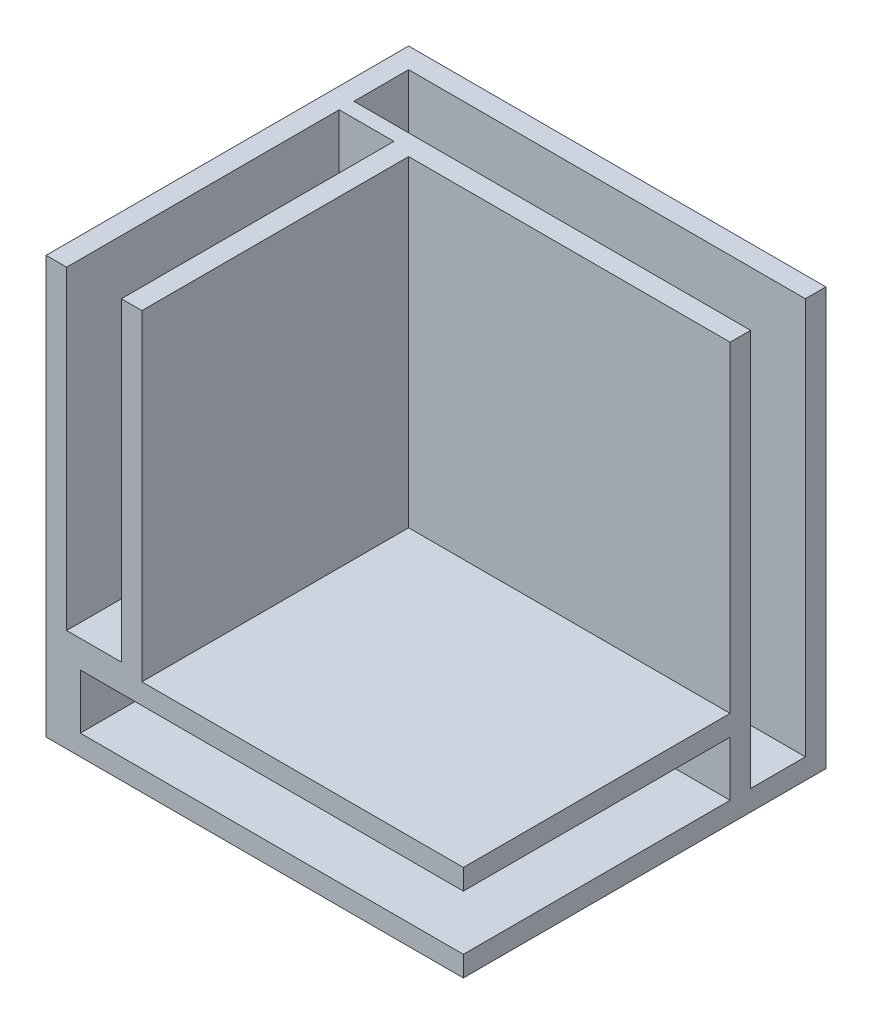
ISO-10303-21;
HEADER;
FILE_DESCRIPTION(('STEP AP214'),'2;1');
FILE_NAME('part.step','',(''),(''),'','','');
FILE_SCHEMA(('AUTOMOTIVE_DESIGN { 1 0 10303 214 1 1 1 1 }'));
ENDSEC;
DATA;
#1=APPLICATION_CONTEXT('core data for automotive mechanical design processes');
#2=APPLICATION_PROTOCOL_DEFINITION('international standard','automotive_design',2000,#1);
#3=PRODUCT_CONTEXT('',#1,'mechanical');
#4=PRODUCT('Part','Part','',(#3));
#5=PRODUCT_RELATED_PRODUCT_CATEGORY('part','',(#4));
#6=PRODUCT_DEFINITION_FORMATION('','',#4);
#7=PRODUCT_DEFINITION_CONTEXT('part definition',#1,'design');
#8=PRODUCT_DEFINITION('design','',#6,#7);
#9=PRODUCT_DEFINITION_SHAPE('','',#8);
#10=(LENGTH_UNIT() NAMED_UNIT(*) SI_UNIT(.MILLI.,.METRE.));
#11=(NAMED_UNIT(*) PLANE_ANGLE_UNIT() SI_UNIT($,.RADIAN.));
#12=(NAMED_UNIT(*) SI_UNIT($,.STERADIAN.) SOLID_ANGLE_UNIT());
#13=UNCERTAINTY_MEASURE_WITH_UNIT(LENGTH_MEASURE(1.E-05),#10,'distance_accuracy_value','');
#14=(GEOMETRIC_REPRESENTATION_CONTEXT(3) GLOBAL_UNCERTAINTY_ASSIGNED_CONTEXT((#13)) GLOBAL_UNIT_ASSIGNED_CONTEXT((#10,
#11,#12)) REPRESENTATION_CONTEXT('',''));
#15=CARTESIAN_POINT('',(0.,0.,0.));
#16=DIRECTION('',(0.,0.,1.));
#17=DIRECTION('',(1.,0.,0.));
#18=AXIS2_PLACEMENT_3D('',#15,#16,#17);
#19=CARTESIAN_POINT('',(5.,0.,26.));
#20=DIRECTION('',(-1.,0.,0.));
#21=DIRECTION('',(0.,0.,1.));
#22=AXIS2_PLACEMENT_3D('',#19,#20,#21);
#23=PLANE('',#22);
#24=DIRECTION('',(0.,1.,0.));
#25=VECTOR('',#24,1.);
#26=CARTESIAN_POINT('',(5.,30.,6.07514362919426));
#27=LINE('',#26,#25);
#28=CARTESIAN_POINT('',(5.,7.,6.07514362919426));
#29=VERTEX_POINT('',#28);
#30=CARTESIAN_POINT('',(5.,30.,6.07514362919426));
#31=VERTEX_POINT('',#30);
#32=EDGE_CURVE('E254',#29,#31,#27,.T.);
#33=ORIENTED_EDGE('',*,*,#32,.F.);
#34=DIRECTION('',(0.,0.,-1.));
#35=VECTOR('',#34,1.);
#36=CARTESIAN_POINT('',(5.,7.,26.));
#37=LINE('',#36,#35);
#38=CARTESIAN_POINT('',(5.,7.,26.));
#39=VERTEX_POINT('',#38);
#40=EDGE_CURVE('E271',#39,#29,#37,.T.);
#41=ORIENTED_EDGE('',*,*,#40,.F.);
#42=DIRECTION('',(0.,1.,0.));
#43=VECTOR('',#42,1.);
#44=CARTESIAN_POINT('',(5.,7.,26.));
#45=LINE('',#44,#43);
#46=CARTESIAN_POINT('',(5.,30.,26.));
#47=VERTEX_POINT('',#46);
#48=EDGE_CURVE('E251',#39,#47,#45,.T.);
#49=ORIENTED_EDGE('',*,*,#48,.T.);
#50=DIRECTION('',(0.,0.,-1.));
#51=VECTOR('',#50,1.);
#52=CARTESIAN_POINT('',(5.,30.,6.));
#53=LINE('',#52,#51);
#54=EDGE_CURVE('E275',#47,#31,#53,.T.);
#55=ORIENTED_EDGE('',*,*,#54,.T.);
#56=EDGE_LOOP('',(#33,#41,#49,#55));
#57=FACE_BOUND('',#56,.T.);
#58=ADVANCED_FACE('F37',(#57),#23,.T.);
#59=CARTESIAN_POINT('',(0.,7.,26.));
#60=DIRECTION('',(0.,-1.,0.));
#61=DIRECTION('',(1.,0.,0.));
#62=AXIS2_PLACEMENT_3D('',#59,#60,#61);
#63=PLANE('',#62);
#64=DIRECTION('',(1.,0.,0.));
#65=VECTOR('',#64,1.);
#66=CARTESIAN_POINT('',(0.,7.,6.07514362919426));
#67=LINE('',#66,#65);
#68=CARTESIAN_POINT('',(1.,7.,6.07514362919426));
#69=VERTEX_POINT('',#68);
#70=EDGE_CURVE('E260',#69,#29,#67,.T.);
#71=ORIENTED_EDGE('',*,*,#70,.F.);
#72=DIRECTION('',(0.,0.,-1.));
#73=VECTOR('',#72,1.);
#74=CARTESIAN_POINT('',(1.,7.,6.));
#75=LINE('',#74,#73);
#76=CARTESIAN_POINT('',(1.,7.,26.));
#77=VERTEX_POINT('',#76);
#78=EDGE_CURVE('E273',#77,#69,#75,.T.);
#79=ORIENTED_EDGE('',*,*,#78,.F.);
#80=DIRECTION('',(1.,0.,0.));
#81=VECTOR('',#80,1.);
#82=CARTESIAN_POINT('',(1.,7.,26.));
#83=LINE('',#82,#81);
#84=EDGE_CURVE('E248',#77,#39,#83,.T.);
#85=ORIENTED_EDGE('',*,*,#84,.T.);
#86=ORIENTED_EDGE('',*,*,#40,.T.);
#87=EDGE_LOOP('',(#71,#79,#85,#86));
#88=FACE_BOUND('',#87,.T.);
#89=ADVANCED_FACE('F346',(#88),#63,.F.);
#90=CARTESIAN_POINT('',(1.,0.,6.));
#91=DIRECTION('',(1.,0.,0.));
#92=DIRECTION('',(0.,0.,-1.));
#93=AXIS2_PLACEMENT_3D('',#90,#91,#92);
#94=PLANE('',#93);
#95=DIRECTION('',(0.,0.,-1.));
#96=VECTOR('',#95,1.);
#97=CARTESIAN_POINT('',(1.,30.,6.));
#98=LINE('',#97,#96);
#99=CARTESIAN_POINT('',(1.,30.,5.));
#100=VERTEX_POINT('',#99);
#101=CARTESIAN_POINT('',(1.,30.,1.));
#102=VERTEX_POINT('',#101);
#103=EDGE_CURVE('E290',#100,#102,#98,.T.);
#104=ORIENTED_EDGE('',*,*,#103,.F.);
#105=DIRECTION('',(0.,-1.,0.));
#106=VECTOR('',#105,1.);
#107=CARTESIAN_POINT('',(1.,0.,5.));
#108=LINE('',#107,#106);
#109=CARTESIAN_POINT('',(1.,1.,5.));
#110=VERTEX_POINT('',#109);
#111=EDGE_CURVE('E264',#100,#110,#108,.T.);
#112=ORIENTED_EDGE('',*,*,#111,.T.);
#113=DIRECTION('',(0.,0.,-1.));
#114=VECTOR('',#113,1.);
#115=CARTESIAN_POINT('',(1.,1.,6.));
#116=LINE('',#115,#114);
#117=CARTESIAN_POINT('',(1.,1.,1.));
#118=VERTEX_POINT('',#117);
#119=EDGE_CURVE('E280',#110,#118,#116,.T.);
#120=ORIENTED_EDGE('',*,*,#119,.T.);
#121=DIRECTION('',(0.,-1.,0.));
#122=VECTOR('',#121,1.);
#123=CARTESIAN_POINT('',(1.,0.,1.));
#124=LINE('',#123,#122);
#125=EDGE_CURVE('E276',#102,#118,#124,.T.);
#126=ORIENTED_EDGE('',*,*,#125,.F.);
#127=EDGE_LOOP('',(#104,#112,#120,#126));
#128=FACE_BOUND('',#127,.T.);
#129=ADVANCED_FACE('F372',(#128),#94,.T.);
#130=DIRECTION('',(0.,1.,0.));
#131=VECTOR('',#130,1.);
#132=CARTESIAN_POINT('',(1.,0.,6.07514362919426));
#133=LINE('',#132,#131);
#134=CARTESIAN_POINT('',(1.,30.,6.07514362919426));
#135=VERTEX_POINT('',#134);
#136=EDGE_CURVE('E11',#69,#135,#133,.T.);
#137=ORIENTED_EDGE('',*,*,#136,.T.);
#138=CARTESIAN_POINT('',(1.,30.,26.));
#139=VERTEX_POINT('',#138);
#140=EDGE_CURVE('E287',#139,#135,#98,.T.);
#141=ORIENTED_EDGE('',*,*,#140,.F.);
#142=DIRECTION('',(0.,-1.,0.));
#143=VECTOR('',#142,1.);
#144=CARTESIAN_POINT('',(1.,7.,26.));
#145=LINE('',#144,#143);
#146=EDGE_CURVE('E245',#139,#77,#145,.T.);
#147=ORIENTED_EDGE('',*,*,#146,.T.);
#148=ORIENTED_EDGE('',*,*,#78,.T.);
#149=EDGE_LOOP('',(#137,#141,#147,#148));
#150=FACE_BOUND('',#149,.T.);
#151=ADVANCED_FACE('F339',(#150),#94,.T.);
#152=CARTESIAN_POINT('',(6.,5.,26.));
#153=DIRECTION('',(0.,-1.,0.));
#154=DIRECTION('',(0.,0.,-1.));
#155=AXIS2_PLACEMENT_3D('',#152,#153,#154);
#156=PLANE('',#155);
#157=DIRECTION('',(-1.,0.,0.));
#158=VECTOR('',#157,1.);
#159=CARTESIAN_POINT('',(30.,5.,6.5));
#160=LINE('',#159,#158);
#161=CARTESIAN_POINT('',(30.,5.,6.5));
#162=VERTEX_POINT('',#161);
#163=CARTESIAN_POINT('',(2.,5.,6.5));
#164=VERTEX_POINT('',#163);
#165=EDGE_CURVE('E60',#162,#164,#160,.T.);
#166=ORIENTED_EDGE('',*,*,#165,.F.);
#167=DIRECTION('',(0.,0.,-1.));
#168=VECTOR('',#167,1.);
#169=CARTESIAN_POINT('',(30.,5.,26.));
#170=LINE('',#169,#168);
#171=CARTESIAN_POINT('',(30.,5.,26.));
#172=VERTEX_POINT('',#171);
#173=EDGE_CURVE('E263',#172,#162,#170,.T.);
#174=ORIENTED_EDGE('',*,*,#173,.F.);
#175=DIRECTION('',(-1.,0.,0.));
#176=VECTOR('',#175,1.);
#177=CARTESIAN_POINT('',(7.,5.,26.));
#178=LINE('',#177,#176);
#179=CARTESIAN_POINT('',(2.,5.,26.));
#180=VERTEX_POINT('',#179);
#181=EDGE_CURVE('E242',#172,#180,#178,.T.);
#182=ORIENTED_EDGE('',*,*,#181,.T.);
#183=DIRECTION('',(0.,0.,1.));
#184=VECTOR('',#183,1.);
#185=CARTESIAN_POINT('',(2.,5.,6.));
#186=LINE('',#185,#184);
#187=EDGE_CURVE('E176',#164,#180,#186,.T.);
#188=ORIENTED_EDGE('',*,*,#187,.F.);
#189=EDGE_LOOP('',(#166,#174,#182,#188));
#190=FACE_BOUND('',#189,.T.);
#191=ADVANCED_FACE('F394',(#190),#156,.T.);
#192=CARTESIAN_POINT('',(0.,1.,6.));
#193=DIRECTION('',(0.,1.,0.));
#194=DIRECTION('',(0.,0.,1.));
#195=AXIS2_PLACEMENT_3D('',#192,#193,#194);
#196=PLANE('',#195);
#197=DIRECTION('',(1.,0.,0.));
#198=VECTOR('',#197,1.);
#199=CARTESIAN_POINT('',(2.,0.999999999999999,6.5));
#200=LINE('',#199,#198);
#201=CARTESIAN_POINT('',(2.,0.999999999999999,6.5));
#202=VERTEX_POINT('',#201);
#203=CARTESIAN_POINT('',(30.,1.,6.5));
#204=VERTEX_POINT('',#203);
#205=EDGE_CURVE('E178',#202,#204,#200,.T.);
#206=ORIENTED_EDGE('',*,*,#205,.F.);
#207=DIRECTION('',(0.,0.,-1.));
#208=VECTOR('',#207,1.);
#209=CARTESIAN_POINT('',(2.,0.999999999999999,26.));
#210=LINE('',#209,#208);
#211=CARTESIAN_POINT('',(2.,0.999999999999999,26.));
#212=VERTEX_POINT('',#211);
#213=EDGE_CURVE('E170',#212,#202,#210,.T.);
#214=ORIENTED_EDGE('',*,*,#213,.F.);
#215=DIRECTION('',(1.,0.,0.));
#216=VECTOR('',#215,1.);
#217=CARTESIAN_POINT('',(7.,1.,26.));
#218=LINE('',#217,#216);
#219=CARTESIAN_POINT('',(30.,1.,26.));
#220=VERTEX_POINT('',#219);
#221=EDGE_CURVE('E240',#212,#220,#218,.T.);
#222=ORIENTED_EDGE('',*,*,#221,.T.);
#223=DIRECTION('',(0.,0.,-1.));
#224=VECTOR('',#223,1.);
#225=CARTESIAN_POINT('',(30.,1.,6.));
#226=LINE('',#225,#224);
#227=EDGE_CURVE('E52',#220,#204,#226,.T.);
#228=ORIENTED_EDGE('',*,*,#227,.T.);
#229=EDGE_LOOP('',(#206,#214,#222,#228));
#230=FACE_BOUND('',#229,.T.);
#231=ADVANCED_FACE('F179',(#230),#196,.T.);
#232=DIRECTION('',(1.,0.,0.));
#233=VECTOR('',#232,1.);
#234=CARTESIAN_POINT('',(0.,1.,5.));
#235=LINE('',#234,#233);
#236=CARTESIAN_POINT('',(30.,1.,5.));
#237=VERTEX_POINT('',#236);
#238=EDGE_CURVE('E266',#110,#237,#235,.T.);
#239=ORIENTED_EDGE('',*,*,#238,.T.);
#240=CARTESIAN_POINT('',(30.,1.,1.));
#241=VERTEX_POINT('',#240);
#242=EDGE_CURVE('E289',#237,#241,#226,.T.);
#243=ORIENTED_EDGE('',*,*,#242,.T.);
#244=DIRECTION('',(1.,0.,0.));
#245=VECTOR('',#244,1.);
#246=CARTESIAN_POINT('',(0.,1.,1.));
#247=LINE('',#246,#245);
#248=EDGE_CURVE('E279',#118,#241,#247,.T.);
#249=ORIENTED_EDGE('',*,*,#248,.F.);
#250=ORIENTED_EDGE('',*,*,#119,.F.);
#251=EDGE_LOOP('',(#239,#243,#249,#250));
#252=FACE_BOUND('',#251,.T.);
#253=ADVANCED_FACE('F368',(#252),#196,.T.);
#254=CARTESIAN_POINT('',(30.,0.,6.));
#255=DIRECTION('',(-1.,0.,0.));
#256=DIRECTION('',(0.,0.,1.));
#257=AXIS2_PLACEMENT_3D('',#254,#255,#256);
#258=PLANE('',#257);
#259=DIRECTION('',(0.,0.,-1.));
#260=VECTOR('',#259,1.);
#261=CARTESIAN_POINT('',(30.,30.,6.));
#262=LINE('',#261,#260);
#263=CARTESIAN_POINT('',(30.,30.,6.5));
#264=VERTEX_POINT('',#263);
#265=CARTESIAN_POINT('',(30.,30.,5.));
#266=VERTEX_POINT('',#265);
#267=EDGE_CURVE('E45',#264,#266,#262,.T.);
#268=ORIENTED_EDGE('',*,*,#267,.F.);
#269=DIRECTION('',(0.,1.,0.));
#270=VECTOR('',#269,1.);
#271=CARTESIAN_POINT('',(30.,6.,6.5));
#272=LINE('',#271,#270);
#273=CARTESIAN_POINT('',(30.,6.5,6.5));
#274=VERTEX_POINT('',#273);
#275=EDGE_CURVE('E202',#274,#264,#272,.T.);
#276=ORIENTED_EDGE('',*,*,#275,.F.);
#277=DIRECTION('',(0.,0.,-1.));
#278=VECTOR('',#277,1.);
#279=CARTESIAN_POINT('',(30.,6.5,26.));
#280=LINE('',#279,#278);
#281=CARTESIAN_POINT('',(30.,6.5,26.));
#282=VERTEX_POINT('',#281);
#283=EDGE_CURVE('E193',#282,#274,#280,.T.);
#284=ORIENTED_EDGE('',*,*,#283,.F.);
#285=DIRECTION('',(0.,1.,0.));
#286=VECTOR('',#285,1.);
#287=CARTESIAN_POINT('',(30.,6.,26.));
#288=LINE('',#287,#286);
#289=EDGE_CURVE('E283',#172,#282,#288,.T.);
#290=ORIENTED_EDGE('',*,*,#289,.F.);
#291=ORIENTED_EDGE('',*,*,#173,.T.);
#292=DIRECTION('',(0.,1.,0.));
#293=VECTOR('',#292,1.);
#294=CARTESIAN_POINT('',(30.,1.,6.5));
#295=LINE('',#294,#293);
#296=EDGE_CURVE('E183',#204,#162,#295,.T.);
#297=ORIENTED_EDGE('',*,*,#296,.F.);
#298=ORIENTED_EDGE('',*,*,#227,.F.);
#299=CARTESIAN_POINT('',(30.,-0.5,26.));
#300=VERTEX_POINT('',#299);
#301=EDGE_CURVE('E301',#300,#220,#288,.T.);
#302=ORIENTED_EDGE('',*,*,#301,.F.);
#303=DIRECTION('',(0.,0.,1.));
#304=VECTOR('',#303,1.);
#305=CARTESIAN_POINT('',(30.,-0.5,0.));
#306=LINE('',#305,#304);
#307=CARTESIAN_POINT('',(30.,-0.5,-0.5));
#308=VERTEX_POINT('',#307);
#309=EDGE_CURVE('E233',#308,#300,#306,.T.);
#310=ORIENTED_EDGE('',*,*,#309,.F.);
#311=DIRECTION('',(0.,-1.,0.));
#312=VECTOR('',#311,1.);
#313=CARTESIAN_POINT('',(30.,30.,-0.5));
#314=LINE('',#313,#312);
#315=CARTESIAN_POINT('',(30.,30.,-0.5));
#316=VERTEX_POINT('',#315);
#317=EDGE_CURVE('E209',#316,#308,#314,.T.);
#318=ORIENTED_EDGE('',*,*,#317,.F.);
#319=CARTESIAN_POINT('',(30.,30.,1.));
#320=VERTEX_POINT('',#319);
#321=EDGE_CURVE('E307',#320,#316,#262,.T.);
#322=ORIENTED_EDGE('',*,*,#321,.F.);
#323=DIRECTION('',(0.,1.,0.));
#324=VECTOR('',#323,1.);
#325=CARTESIAN_POINT('',(30.,0.,1.));
#326=LINE('',#325,#324);
#327=EDGE_CURVE('E286',#241,#320,#326,.T.);
#328=ORIENTED_EDGE('',*,*,#327,.F.);
#329=ORIENTED_EDGE('',*,*,#242,.F.);
#330=DIRECTION('',(0.,1.,0.));
#331=VECTOR('',#330,1.);
#332=CARTESIAN_POINT('',(30.,0.,5.));
#333=LINE('',#332,#331);
#334=EDGE_CURVE('E270',#237,#266,#333,.T.);
#335=ORIENTED_EDGE('',*,*,#334,.T.);
#336=EDGE_LOOP('',(#268,#276,#284,#290,#291,#297,#298,#302,#310,#318,#322,#328,#329,#335));
#337=FACE_BOUND('',#336,.T.);
#338=ADVANCED_FACE('F39',(#337),#258,.F.);
#339=CARTESIAN_POINT('',(0.,30.,6.));
#340=DIRECTION('',(0.,-1.,0.));
#341=DIRECTION('',(0.,0.,-1.));
#342=AXIS2_PLACEMENT_3D('',#339,#340,#341);
#343=PLANE('',#342);
#344=DIRECTION('',(-1.,0.,0.));
#345=VECTOR('',#344,1.);
#346=CARTESIAN_POINT('',(0.,30.,26.));
#347=LINE('',#346,#345);
#348=CARTESIAN_POINT('',(-0.5,30.,26.));
#349=VERTEX_POINT('',#348);
#350=EDGE_CURVE('E304',#139,#349,#347,.T.);
#351=ORIENTED_EDGE('',*,*,#350,.F.);
#352=ORIENTED_EDGE('',*,*,#140,.T.);
#353=DIRECTION('',(1.,0.,0.));
#354=VECTOR('',#353,1.);
#355=CARTESIAN_POINT('',(0.,30.,6.07514362919426));
#356=LINE('',#355,#354);
#357=EDGE_CURVE('E257',#135,#31,#356,.T.);
#358=ORIENTED_EDGE('',*,*,#357,.T.);
#359=ORIENTED_EDGE('',*,*,#54,.F.);
#360=CARTESIAN_POINT('',(6.5,30.,26.));
#361=VERTEX_POINT('',#360);
#362=EDGE_CURVE('E305',#361,#47,#347,.T.);
#363=ORIENTED_EDGE('',*,*,#362,.F.);
#364=DIRECTION('',(0.,0.,1.));
#365=VECTOR('',#364,1.);
#366=CARTESIAN_POINT('',(6.5,30.,6.));
#367=LINE('',#366,#365);
#368=CARTESIAN_POINT('',(6.5,30.,6.5));
#369=VERTEX_POINT('',#368);
#370=EDGE_CURVE('E223',#369,#361,#367,.T.);
#371=ORIENTED_EDGE('',*,*,#370,.F.);
#372=DIRECTION('',(-1.,0.,0.));
#373=VECTOR('',#372,1.);
#374=CARTESIAN_POINT('',(30.,30.,6.5));
#375=LINE('',#374,#373);
#376=EDGE_CURVE('E204',#264,#369,#375,.T.);
#377=ORIENTED_EDGE('',*,*,#376,.F.);
#378=ORIENTED_EDGE('',*,*,#267,.T.);
#379=DIRECTION('',(-1.,0.,0.));
#380=VECTOR('',#379,1.);
#381=CARTESIAN_POINT('',(0.,30.,5.));
#382=LINE('',#381,#380);
#383=EDGE_CURVE('E292',#266,#100,#382,.T.);
#384=ORIENTED_EDGE('',*,*,#383,.T.);
#385=ORIENTED_EDGE('',*,*,#103,.T.);
#386=DIRECTION('',(-1.,0.,0.));
#387=VECTOR('',#386,1.);
#388=CARTESIAN_POINT('',(0.,30.,1.));
#389=LINE('',#388,#387);
#390=EDGE_CURVE('E267',#320,#102,#389,.T.);
#391=ORIENTED_EDGE('',*,*,#390,.F.);
#392=ORIENTED_EDGE('',*,*,#321,.T.);
#393=DIRECTION('',(1.,0.,0.));
#394=VECTOR('',#393,1.);
#395=CARTESIAN_POINT('',(-0.5,30.,-0.5));
#396=LINE('',#395,#394);
#397=CARTESIAN_POINT('',(-0.5,30.,-0.5));
#398=VERTEX_POINT('',#397);
#399=EDGE_CURVE('E218',#398,#316,#396,.T.);
#400=ORIENTED_EDGE('',*,*,#399,.F.);
#401=DIRECTION('',(0.,0.,-1.));
#402=VECTOR('',#401,1.);
#403=CARTESIAN_POINT('',(-0.5,30.,26.));
#404=LINE('',#403,#402);
#405=EDGE_CURVE('E228',#349,#398,#404,.T.);
#406=ORIENTED_EDGE('',*,*,#405,.F.);
#407=EDGE_LOOP('',(#351,#352,#358,#359,#363,#371,#377,#378,#384,#385,#391,#392,#400,#406));
#408=FACE_BOUND('',#407,.T.);
#409=ADVANCED_FACE('F316',(#408),#343,.F.);
#410=CARTESIAN_POINT('',(0.,0.,26.));
#411=DIRECTION('',(0.,0.,1.));
#412=DIRECTION('',(1.,0.,0.));
#413=AXIS2_PLACEMENT_3D('',#410,#411,#412);
#414=PLANE('',#413);
#415=DIRECTION('',(0.,-1.,0.));
#416=VECTOR('',#415,1.);
#417=CARTESIAN_POINT('',(6.5,30.,26.));
#418=LINE('',#417,#416);
#419=CARTESIAN_POINT('',(6.5,6.5,26.));
#420=VERTEX_POINT('',#419);
#421=EDGE_CURVE('E221',#361,#420,#418,.T.);
#422=ORIENTED_EDGE('',*,*,#421,.F.);
#423=ORIENTED_EDGE('',*,*,#362,.T.);
#424=ORIENTED_EDGE('',*,*,#48,.F.);
#425=ORIENTED_EDGE('',*,*,#84,.F.);
#426=ORIENTED_EDGE('',*,*,#146,.F.);
#427=ORIENTED_EDGE('',*,*,#350,.T.);
#428=DIRECTION('',(0.,1.,0.));
#429=VECTOR('',#428,1.);
#430=CARTESIAN_POINT('',(-0.5,-0.5,26.));
#431=LINE('',#430,#429);
#432=CARTESIAN_POINT('',(-0.5,-0.5,26.));
#433=VERTEX_POINT('',#432);
#434=EDGE_CURVE('E225',#433,#349,#431,.T.);
#435=ORIENTED_EDGE('',*,*,#434,.F.);
#436=DIRECTION('',(-1.,0.,0.));
#437=VECTOR('',#436,1.);
#438=CARTESIAN_POINT('',(30.,-0.5,26.));
#439=LINE('',#438,#437);
#440=EDGE_CURVE('E236',#300,#433,#439,.T.);
#441=ORIENTED_EDGE('',*,*,#440,.F.);
#442=ORIENTED_EDGE('',*,*,#301,.T.);
#443=ORIENTED_EDGE('',*,*,#221,.F.);
#444=DIRECTION('',(0.,-1.,0.));
#445=VECTOR('',#444,1.);
#446=CARTESIAN_POINT('',(2.,5.,26.));
#447=LINE('',#446,#445);
#448=EDGE_CURVE('E175',#180,#212,#447,.T.);
#449=ORIENTED_EDGE('',*,*,#448,.F.);
#450=ORIENTED_EDGE('',*,*,#181,.F.);
#451=ORIENTED_EDGE('',*,*,#289,.T.);
#452=DIRECTION('',(1.,0.,0.));
#453=VECTOR('',#452,1.);
#454=CARTESIAN_POINT('',(6.5,6.5,26.));
#455=LINE('',#454,#453);
#456=EDGE_CURVE('E190',#420,#282,#455,.T.);
#457=ORIENTED_EDGE('',*,*,#456,.F.);
#458=EDGE_LOOP('',(#422,#423,#424,#425,#426,#427,#435,#441,#442,#443,#449,#450,#451,#457));
#459=FACE_BOUND('',#458,.T.);
#460=ADVANCED_FACE('F335',(#459),#414,.T.);
#461=CARTESIAN_POINT('',(0.,0.,5.));
#462=DIRECTION('',(0.,0.,-1.));
#463=DIRECTION('',(-1.,0.,0.));
#464=AXIS2_PLACEMENT_3D('',#461,#462,#463);
#465=PLANE('',#464);
#466=ORIENTED_EDGE('',*,*,#111,.F.);
#467=ORIENTED_EDGE('',*,*,#383,.F.);
#468=ORIENTED_EDGE('',*,*,#334,.F.);
#469=ORIENTED_EDGE('',*,*,#238,.F.);
#470=EDGE_LOOP('',(#466,#467,#468,#469));
#471=FACE_BOUND('',#470,.T.);
#472=ADVANCED_FACE('F365',(#471),#465,.T.);
#473=CARTESIAN_POINT('',(0.,0.,1.));
#474=DIRECTION('',(0.,0.,-1.));
#475=DIRECTION('',(-1.,0.,0.));
#476=AXIS2_PLACEMENT_3D('',#473,#474,#475);
#477=PLANE('',#476);
#478=ORIENTED_EDGE('',*,*,#125,.T.);
#479=ORIENTED_EDGE('',*,*,#248,.T.);
#480=ORIENTED_EDGE('',*,*,#327,.T.);
#481=ORIENTED_EDGE('',*,*,#390,.T.);
#482=EDGE_LOOP('',(#478,#479,#480,#481));
#483=FACE_BOUND('',#482,.T.);
#484=ADVANCED_FACE('F374',(#483),#477,.F.);
#485=CARTESIAN_POINT('',(0.,30.,6.07514362919426));
#486=DIRECTION('',(0.,0.,-1.));
#487=DIRECTION('',(0.,1.,0.));
#488=AXIS2_PLACEMENT_3D('',#485,#486,#487);
#489=PLANE('',#488);
#490=ORIENTED_EDGE('',*,*,#136,.F.);
#491=ORIENTED_EDGE('',*,*,#70,.T.);
#492=ORIENTED_EDGE('',*,*,#32,.T.);
#493=ORIENTED_EDGE('',*,*,#357,.F.);
#494=EDGE_LOOP('',(#490,#491,#492,#493));
#495=FACE_BOUND('',#494,.T.);
#496=ADVANCED_FACE('F343',(#495),#489,.F.);
#497=CARTESIAN_POINT('',(2.,0.,0.));
#498=DIRECTION('',(1.,0.,0.));
#499=DIRECTION('',(0.,1.,0.));
#500=AXIS2_PLACEMENT_3D('',#497,#498,#499);
#501=PLANE('',#500);
#502=DIRECTION('',(0.,-1.,0.));
#503=VECTOR('',#502,1.);
#504=CARTESIAN_POINT('',(2.,5.,6.5));
#505=LINE('',#504,#503);
#506=EDGE_CURVE('E173',#164,#202,#505,.T.);
#507=ORIENTED_EDGE('',*,*,#506,.F.);
#508=ORIENTED_EDGE('',*,*,#187,.T.);
#509=ORIENTED_EDGE('',*,*,#448,.T.);
#510=ORIENTED_EDGE('',*,*,#213,.T.);
#511=EDGE_LOOP('',(#507,#508,#509,#510));
#512=FACE_BOUND('',#511,.T.);
#513=ADVANCED_FACE('F171',(#512),#501,.T.);
#514=CARTESIAN_POINT('',(0.,-0.5,0.));
#515=DIRECTION('',(0.,-1.,0.));
#516=DIRECTION('',(0.,0.,-1.));
#517=AXIS2_PLACEMENT_3D('',#514,#515,#516);
#518=PLANE('',#517);
#519=ORIENTED_EDGE('',*,*,#440,.T.);
#520=DIRECTION('',(0.,0.,1.));
#521=VECTOR('',#520,1.);
#522=CARTESIAN_POINT('',(-0.5,-0.5,0.));
#523=LINE('',#522,#521);
#524=CARTESIAN_POINT('',(-0.5,-0.5,-0.5));
#525=VERTEX_POINT('',#524);
#526=EDGE_CURVE('E230',#525,#433,#523,.T.);
#527=ORIENTED_EDGE('',*,*,#526,.F.);
#528=DIRECTION('',(-1.,0.,0.));
#529=VECTOR('',#528,1.);
#530=CARTESIAN_POINT('',(30.,-0.5,-0.5));
#531=LINE('',#530,#529);
#532=EDGE_CURVE('E212',#308,#525,#531,.T.);
#533=ORIENTED_EDGE('',*,*,#532,.F.);
#534=ORIENTED_EDGE('',*,*,#309,.T.);
#535=EDGE_LOOP('',(#519,#527,#533,#534));
#536=FACE_BOUND('',#535,.T.);
#537=ADVANCED_FACE('F327',(#536),#518,.T.);
#538=CARTESIAN_POINT('',(-0.5,0.,0.));
#539=DIRECTION('',(-1.,0.,0.));
#540=DIRECTION('',(0.,0.,1.));
#541=AXIS2_PLACEMENT_3D('',#538,#539,#540);
#542=PLANE('',#541);
#543=ORIENTED_EDGE('',*,*,#434,.T.);
#544=ORIENTED_EDGE('',*,*,#405,.T.);
#545=DIRECTION('',(0.,1.,0.));
#546=VECTOR('',#545,1.);
#547=CARTESIAN_POINT('',(-0.5,-0.5,-0.5));
#548=LINE('',#547,#546);
#549=EDGE_CURVE('E215',#525,#398,#548,.T.);
#550=ORIENTED_EDGE('',*,*,#549,.F.);
#551=ORIENTED_EDGE('',*,*,#526,.T.);
#552=EDGE_LOOP('',(#543,#544,#550,#551));
#553=FACE_BOUND('',#552,.T.);
#554=ADVANCED_FACE('F329',(#553),#542,.T.);
#555=CARTESIAN_POINT('',(6.5,0.,0.));
#556=DIRECTION('',(1.,0.,0.));
#557=DIRECTION('',(0.,0.,-1.));
#558=AXIS2_PLACEMENT_3D('',#555,#556,#557);
#559=PLANE('',#558);
#560=DIRECTION('',(0.,0.,1.));
#561=VECTOR('',#560,1.);
#562=CARTESIAN_POINT('',(6.5,6.5,6.5));
#563=LINE('',#562,#561);
#564=CARTESIAN_POINT('',(6.5,6.5,6.5));
#565=VERTEX_POINT('',#564);
#566=EDGE_CURVE('E199',#565,#420,#563,.T.);
#567=ORIENTED_EDGE('',*,*,#566,.F.);
#568=DIRECTION('',(0.,-1.,0.));
#569=VECTOR('',#568,1.);
#570=CARTESIAN_POINT('',(6.5,30.,6.5));
#571=LINE('',#570,#569);
#572=EDGE_CURVE('E207',#369,#565,#571,.T.);
#573=ORIENTED_EDGE('',*,*,#572,.F.);
#574=ORIENTED_EDGE('',*,*,#370,.T.);
#575=ORIENTED_EDGE('',*,*,#421,.T.);
#576=EDGE_LOOP('',(#567,#573,#574,#575));
#577=FACE_BOUND('',#576,.T.);
#578=ADVANCED_FACE('F353',(#577),#559,.T.);
#579=CARTESIAN_POINT('',(0.,0.,-0.5));
#580=DIRECTION('',(0.,0.,-1.));
#581=DIRECTION('',(-1.,0.,0.));
#582=AXIS2_PLACEMENT_3D('',#579,#580,#581);
#583=PLANE('',#582);
#584=ORIENTED_EDGE('',*,*,#317,.T.);
#585=ORIENTED_EDGE('',*,*,#532,.T.);
#586=ORIENTED_EDGE('',*,*,#549,.T.);
#587=ORIENTED_EDGE('',*,*,#399,.T.);
#588=EDGE_LOOP('',(#584,#585,#586,#587));
#589=FACE_BOUND('',#588,.T.);
#590=ADVANCED_FACE('F322',(#589),#583,.T.);
#591=CARTESIAN_POINT('',(0.,0.,6.5));
#592=DIRECTION('',(0.,0.,1.));
#593=DIRECTION('',(1.,0.,0.));
#594=AXIS2_PLACEMENT_3D('',#591,#592,#593);
#595=PLANE('',#594);
#596=DIRECTION('',(-1.,0.,0.));
#597=VECTOR('',#596,1.);
#598=CARTESIAN_POINT('',(30.,6.5,6.5));
#599=LINE('',#598,#597);
#600=EDGE_CURVE('E196',#274,#565,#599,.T.);
#601=ORIENTED_EDGE('',*,*,#600,.F.);
#602=ORIENTED_EDGE('',*,*,#275,.T.);
#603=ORIENTED_EDGE('',*,*,#376,.T.);
#604=ORIENTED_EDGE('',*,*,#572,.T.);
#605=EDGE_LOOP('',(#601,#602,#603,#604));
#606=FACE_BOUND('',#605,.T.);
#607=ADVANCED_FACE('F359',(#606),#595,.T.);
#608=CARTESIAN_POINT('',(0.,6.5,0.));
#609=DIRECTION('',(0.,1.,0.));
#610=DIRECTION('',(0.,0.,1.));
#611=AXIS2_PLACEMENT_3D('',#608,#609,#610);
#612=PLANE('',#611);
#613=ORIENTED_EDGE('',*,*,#456,.T.);
#614=ORIENTED_EDGE('',*,*,#283,.T.);
#615=ORIENTED_EDGE('',*,*,#600,.T.);
#616=ORIENTED_EDGE('',*,*,#566,.T.);
#617=EDGE_LOOP('',(#613,#614,#615,#616));
#618=FACE_BOUND('',#617,.T.);
#619=ADVANCED_FACE('F355',(#618),#612,.T.);
#620=CARTESIAN_POINT('',(0.,0.,6.5));
#621=DIRECTION('',(0.,0.,1.));
#622=DIRECTION('',(1.,0.,0.));
#623=AXIS2_PLACEMENT_3D('',#620,#621,#622);
#624=PLANE('',#623);
#625=ORIENTED_EDGE('',*,*,#506,.T.);
#626=ORIENTED_EDGE('',*,*,#205,.T.);
#627=ORIENTED_EDGE('',*,*,#296,.T.);
#628=ORIENTED_EDGE('',*,*,#165,.T.);
#629=EDGE_LOOP('',(#625,#626,#627,#628));
#630=FACE_BOUND('',#629,.T.);
#631=ADVANCED_FACE('F185',(#630),#624,.T.);
#632=CLOSED_SHELL('',(#58,#89,#129,#151,#191,#231,#253,#338,#409,#460,#472,#484,#496,#513,#537,
#554,#578,#590,#607,#619,#631));
#633=MANIFOLD_SOLID_BREP('B2',#632);
#634=ADVANCED_BREP_SHAPE_REPRESENTATION('',(#18,#633),#14);
#635=SHAPE_DEFINITION_REPRESENTATION(#9,#634);
ENDSEC;
END-ISO-10303-21;
